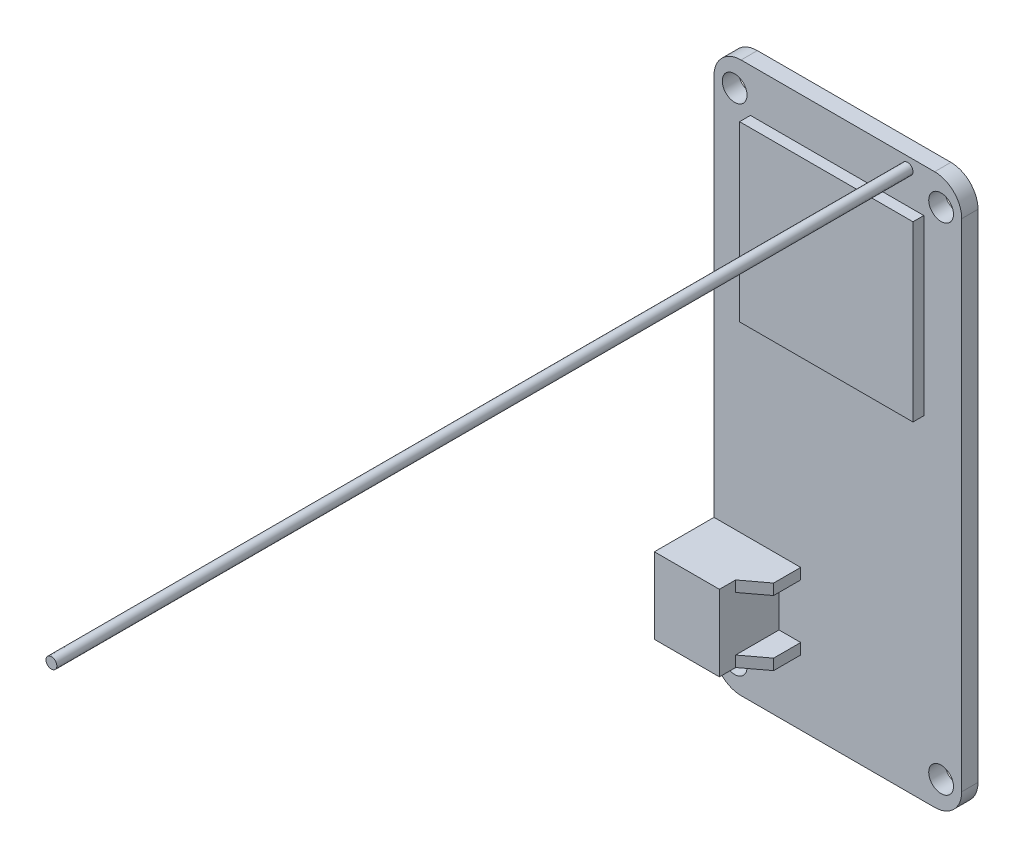
ISO-10303-21;
HEADER;
FILE_DESCRIPTION(('STEP AP214'),'2;1');
FILE_NAME('part.step','',(''),(''),'','','');
FILE_SCHEMA(('AUTOMOTIVE_DESIGN { 1 0 10303 214 1 1 1 1 }'));
ENDSEC;
DATA;
#1=APPLICATION_CONTEXT('core data for automotive mechanical design processes');
#2=APPLICATION_PROTOCOL_DEFINITION('international standard','automotive_design',2000,#1);
#3=PRODUCT_CONTEXT('',#1,'mechanical');
#4=PRODUCT('Part','Part','',(#3));
#5=PRODUCT_RELATED_PRODUCT_CATEGORY('part','',(#4));
#6=PRODUCT_DEFINITION_FORMATION('','',#4);
#7=PRODUCT_DEFINITION_CONTEXT('part definition',#1,'design');
#8=PRODUCT_DEFINITION('design','',#6,#7);
#9=PRODUCT_DEFINITION_SHAPE('','',#8);
#10=(LENGTH_UNIT() NAMED_UNIT(*) SI_UNIT(.MILLI.,.METRE.));
#11=(NAMED_UNIT(*) PLANE_ANGLE_UNIT() SI_UNIT($,.RADIAN.));
#12=(NAMED_UNIT(*) SI_UNIT($,.STERADIAN.) SOLID_ANGLE_UNIT());
#13=UNCERTAINTY_MEASURE_WITH_UNIT(LENGTH_MEASURE(1.E-05),#10,'distance_accuracy_value','');
#14=(GEOMETRIC_REPRESENTATION_CONTEXT(3) GLOBAL_UNCERTAINTY_ASSIGNED_CONTEXT((#13)) GLOBAL_UNIT_ASSIGNED_CONTEXT((#10,
#11,#12)) REPRESENTATION_CONTEXT('',''));
#15=CARTESIAN_POINT('',(0.,0.,0.));
#16=DIRECTION('',(0.,0.,1.));
#17=DIRECTION('',(1.,0.,0.));
#18=AXIS2_PLACEMENT_3D('',#15,#16,#17);
#19=CARTESIAN_POINT('',(-8.93,22.9,3.52777777777778));
#20=DIRECTION('',(0.,0.,1.));
#21=DIRECTION('',(1.,0.,0.));
#22=AXIS2_PLACEMENT_3D('',#19,#20,#21);
#23=PLANE('',#22);
#24=CARTESIAN_POINT('',(6.43,24.4,3.52777777777778));
#25=DIRECTION('',(0.,0.,1.));
#26=DIRECTION('',(1.,0.,0.));
#27=AXIS2_PLACEMENT_3D('',#24,#25,#26);
#28=CIRCLE('',#27,0.5);
#29=CARTESIAN_POINT('',(6.93,24.4,3.52777777777778));
#30=VERTEX_POINT('',#29);
#31=EDGE_CURVE('E249',#30,#30,#28,.T.);
#32=ORIENTED_EDGE('',*,*,#31,.F.);
#33=EDGE_LOOP('',(#32));
#34=FACE_BOUND('',#33,.T.);
#35=CARTESIAN_POINT('',(9.525,-22.86,3.52777777777778));
#36=DIRECTION('',(0.,0.,1.));
#37=DIRECTION('',(-1.,0.,0.));
#38=AXIS2_PLACEMENT_3D('',#35,#36,#37);
#39=CIRCLE('',#38,1.143);
#40=CARTESIAN_POINT('',(8.382,-22.86,3.52777777777778));
#41=VERTEX_POINT('',#40);
#42=EDGE_CURVE('E284',#41,#41,#39,.T.);
#43=ORIENTED_EDGE('',*,*,#42,.F.);
#44=EDGE_LOOP('',(#43));
#45=FACE_BOUND('',#44,.T.);
#46=CARTESIAN_POINT('',(-9.525,-22.86,3.52777777777778));
#47=DIRECTION('',(0.,0.,1.));
#48=DIRECTION('',(-1.,0.,0.));
#49=AXIS2_PLACEMENT_3D('',#46,#47,#48);
#50=CIRCLE('',#49,1.143);
#51=CARTESIAN_POINT('',(-10.668,-22.86,3.52777777777778));
#52=VERTEX_POINT('',#51);
#53=EDGE_CURVE('E288',#52,#52,#50,.T.);
#54=ORIENTED_EDGE('',*,*,#53,.F.);
#55=EDGE_LOOP('',(#54));
#56=FACE_BOUND('',#55,.T.);
#57=CARTESIAN_POINT('',(-9.525,22.86,3.52777777777778));
#58=DIRECTION('',(0.,0.,1.));
#59=DIRECTION('',(-1.,0.,0.));
#60=AXIS2_PLACEMENT_3D('',#57,#58,#59);
#61=CIRCLE('',#60,1.143);
#62=CARTESIAN_POINT('',(-10.668,22.86,3.52777777777778));
#63=VERTEX_POINT('',#62);
#64=EDGE_CURVE('E294',#63,#63,#61,.T.);
#65=ORIENTED_EDGE('',*,*,#64,.F.);
#66=EDGE_LOOP('',(#65));
#67=FACE_BOUND('',#66,.T.);
#68=CARTESIAN_POINT('',(9.525,22.86,3.52777777777778));
#69=DIRECTION('',(0.,0.,1.));
#70=DIRECTION('',(-1.,0.,0.));
#71=AXIS2_PLACEMENT_3D('',#68,#69,#70);
#72=CIRCLE('',#71,1.143);
#73=CARTESIAN_POINT('',(8.382,22.86,3.52777777777778));
#74=VERTEX_POINT('',#73);
#75=EDGE_CURVE('E300',#74,#74,#72,.T.);
#76=ORIENTED_EDGE('',*,*,#75,.F.);
#77=EDGE_LOOP('',(#76));
#78=FACE_BOUND('',#77,.T.);
#79=DIRECTION('',(-1.,0.,0.));
#80=VECTOR('',#79,1.);
#81=CARTESIAN_POINT('',(-8.07,21.4,3.52777777777778));
#82=LINE('',#81,#80);
#83=CARTESIAN_POINT('',(7.93,21.4,3.52777777777778));
#84=VERTEX_POINT('',#83);
#85=CARTESIAN_POINT('',(-8.07,21.4,3.52777777777778));
#86=VERTEX_POINT('',#85);
#87=EDGE_CURVE('E269',#84,#86,#82,.T.);
#88=ORIENTED_EDGE('',*,*,#87,.F.);
#89=DIRECTION('',(0.,1.,0.));
#90=VECTOR('',#89,1.);
#91=CARTESIAN_POINT('',(7.93,21.4,3.52777777777778));
#92=LINE('',#91,#90);
#93=CARTESIAN_POINT('',(7.93,5.4,3.52777777777778));
#94=VERTEX_POINT('',#93);
#95=EDGE_CURVE('E253',#94,#84,#92,.T.);
#96=ORIENTED_EDGE('',*,*,#95,.F.);
#97=DIRECTION('',(1.,0.,0.));
#98=VECTOR('',#97,1.);
#99=CARTESIAN_POINT('',(-8.07,5.4,3.52777777777778));
#100=LINE('',#99,#98);
#101=CARTESIAN_POINT('',(-8.07,5.4,3.52777777777778));
#102=VERTEX_POINT('',#101);
#103=EDGE_CURVE('E260',#102,#94,#100,.T.);
#104=ORIENTED_EDGE('',*,*,#103,.F.);
#105=DIRECTION('',(0.,-1.,0.));
#106=VECTOR('',#105,1.);
#107=CARTESIAN_POINT('',(-8.07,21.4,3.52777777777778));
#108=LINE('',#107,#106);
#109=EDGE_CURVE('E271',#86,#102,#108,.T.);
#110=ORIENTED_EDGE('',*,*,#109,.F.);
#111=EDGE_LOOP('',(#88,#96,#104,#110));
#112=FACE_BOUND('',#111,.T.);
#113=DIRECTION('',(0.,-1.,0.));
#114=VECTOR('',#113,1.);
#115=CARTESIAN_POINT('',(-11.43,22.9,3.52777777777778));
#116=LINE('',#115,#114);
#117=CARTESIAN_POINT('',(-11.43,22.9,3.52777777777778));
#118=VERTEX_POINT('',#117);
#119=CARTESIAN_POINT('',(-11.43,-12.4,3.52777777777778));
#120=VERTEX_POINT('',#119);
#121=EDGE_CURVE('E337',#118,#120,#116,.T.);
#122=ORIENTED_EDGE('',*,*,#121,.T.);
#123=DIRECTION('',(-1.,0.,0.));
#124=VECTOR('',#123,1.);
#125=CARTESIAN_POINT('',(-11.43,-12.4,3.52777777777778));
#126=LINE('',#125,#124);
#127=CARTESIAN_POINT('',(-3.43,-12.4,3.52777777777778));
#128=VERTEX_POINT('',#127);
#129=EDGE_CURVE('E232',#128,#120,#126,.T.);
#130=ORIENTED_EDGE('',*,*,#129,.F.);
#131=DIRECTION('',(0.,1.,0.));
#132=VECTOR('',#131,1.);
#133=CARTESIAN_POINT('',(-3.43,-12.4,3.52777777777778));
#134=LINE('',#133,#132);
#135=CARTESIAN_POINT('',(-3.43,-13.4,3.52777777777778));
#136=VERTEX_POINT('',#135);
#137=EDGE_CURVE('E229',#136,#128,#134,.T.);
#138=ORIENTED_EDGE('',*,*,#137,.F.);
#139=DIRECTION('',(1.,0.,0.));
#140=VECTOR('',#139,1.);
#141=CARTESIAN_POINT('',(-3.43,-13.4,3.52777777777778));
#142=LINE('',#141,#140);
#143=CARTESIAN_POINT('',(-5.43,-13.4,3.52777777777778));
#144=VERTEX_POINT('',#143);
#145=EDGE_CURVE('E226',#144,#136,#142,.T.);
#146=ORIENTED_EDGE('',*,*,#145,.F.);
#147=DIRECTION('',(0.,1.,0.));
#148=VECTOR('',#147,1.);
#149=CARTESIAN_POINT('',(-5.43,-13.4,3.52777777777778));
#150=LINE('',#149,#148);
#151=CARTESIAN_POINT('',(-5.43,-18.4,3.52777777777778));
#152=VERTEX_POINT('',#151);
#153=EDGE_CURVE('E223',#152,#144,#150,.T.);
#154=ORIENTED_EDGE('',*,*,#153,.F.);
#155=DIRECTION('',(-1.,0.,0.));
#156=VECTOR('',#155,1.);
#157=CARTESIAN_POINT('',(-5.43,-18.4,3.52777777777778));
#158=LINE('',#157,#156);
#159=CARTESIAN_POINT('',(-3.43,-18.4,3.52777777777778));
#160=VERTEX_POINT('',#159);
#161=EDGE_CURVE('E219',#160,#152,#158,.T.);
#162=ORIENTED_EDGE('',*,*,#161,.F.);
#163=DIRECTION('',(0.,1.,0.));
#164=VECTOR('',#163,1.);
#165=CARTESIAN_POINT('',(-3.43,-18.4,3.52777777777778));
#166=LINE('',#165,#164);
#167=CARTESIAN_POINT('',(-3.43,-19.4,3.52777777777778));
#168=VERTEX_POINT('',#167);
#169=EDGE_CURVE('E216',#168,#160,#166,.T.);
#170=ORIENTED_EDGE('',*,*,#169,.F.);
#171=DIRECTION('',(1.,0.,0.));
#172=VECTOR('',#171,1.);
#173=CARTESIAN_POINT('',(-11.43,-19.4,3.52777777777778));
#174=LINE('',#173,#172);
#175=CARTESIAN_POINT('',(-11.43,-19.4,3.52777777777778));
#176=VERTEX_POINT('',#175);
#177=EDGE_CURVE('E195',#176,#168,#174,.T.);
#178=ORIENTED_EDGE('',*,*,#177,.F.);
#179=CARTESIAN_POINT('',(-11.43,-22.9,3.52777777777778));
#180=VERTEX_POINT('',#179);
#181=EDGE_CURVE('E336',#176,#180,#116,.T.);
#182=ORIENTED_EDGE('',*,*,#181,.T.);
#183=CARTESIAN_POINT('',(-8.93,-22.9,3.52777777777778));
#184=DIRECTION('',(0.,0.,1.));
#185=DIRECTION('',(1.,0.,0.));
#186=AXIS2_PLACEMENT_3D('',#183,#184,#185);
#187=CIRCLE('',#186,2.5);
#188=CARTESIAN_POINT('',(-8.93,-25.4,3.52777777777778));
#189=VERTEX_POINT('',#188);
#190=EDGE_CURVE('E339',#180,#189,#187,.T.);
#191=ORIENTED_EDGE('',*,*,#190,.T.);
#192=DIRECTION('',(1.,0.,0.));
#193=VECTOR('',#192,1.);
#194=CARTESIAN_POINT('',(-8.93,-25.4,3.52777777777778));
#195=LINE('',#194,#193);
#196=CARTESIAN_POINT('',(8.93,-25.4,3.52777777777778));
#197=VERTEX_POINT('',#196);
#198=EDGE_CURVE('E342',#189,#197,#195,.T.);
#199=ORIENTED_EDGE('',*,*,#198,.T.);
#200=CARTESIAN_POINT('',(8.93,-22.9,3.52777777777778));
#201=DIRECTION('',(0.,0.,1.));
#202=DIRECTION('',(1.,0.,0.));
#203=AXIS2_PLACEMENT_3D('',#200,#201,#202);
#204=CIRCLE('',#203,2.5);
#205=CARTESIAN_POINT('',(11.43,-22.9,3.52777777777778));
#206=VERTEX_POINT('',#205);
#207=EDGE_CURVE('E345',#197,#206,#204,.T.);
#208=ORIENTED_EDGE('',*,*,#207,.T.);
#209=DIRECTION('',(0.,1.,0.));
#210=VECTOR('',#209,1.);
#211=CARTESIAN_POINT('',(11.43,-22.9,3.52777777777778));
#212=LINE('',#211,#210);
#213=CARTESIAN_POINT('',(11.43,22.9,3.52777777777778));
#214=VERTEX_POINT('',#213);
#215=EDGE_CURVE('E348',#206,#214,#212,.T.);
#216=ORIENTED_EDGE('',*,*,#215,.T.);
#217=CARTESIAN_POINT('',(8.93,22.9,3.52777777777778));
#218=DIRECTION('',(0.,0.,1.));
#219=DIRECTION('',(1.,0.,0.));
#220=AXIS2_PLACEMENT_3D('',#217,#218,#219);
#221=CIRCLE('',#220,2.5);
#222=CARTESIAN_POINT('',(8.93,25.4,3.52777777777778));
#223=VERTEX_POINT('',#222);
#224=EDGE_CURVE('E351',#214,#223,#221,.T.);
#225=ORIENTED_EDGE('',*,*,#224,.T.);
#226=DIRECTION('',(-1.,0.,0.));
#227=VECTOR('',#226,1.);
#228=CARTESIAN_POINT('',(8.93,25.4,3.52777777777778));
#229=LINE('',#228,#227);
#230=CARTESIAN_POINT('',(-8.93,25.4,3.52777777777778));
#231=VERTEX_POINT('',#230);
#232=EDGE_CURVE('E313',#223,#231,#229,.T.);
#233=ORIENTED_EDGE('',*,*,#232,.T.);
#234=CARTESIAN_POINT('',(-8.93,22.9,3.52777777777778));
#235=DIRECTION('',(0.,0.,1.));
#236=DIRECTION('',(1.,0.,0.));
#237=AXIS2_PLACEMENT_3D('',#234,#235,#236);
#238=CIRCLE('',#237,2.5);
#239=EDGE_CURVE('E306',#231,#118,#238,.T.);
#240=ORIENTED_EDGE('',*,*,#239,.T.);
#241=EDGE_LOOP('',(#122,#130,#138,#146,#154,#162,#170,#178,#182,#191,#199,#208,#216,#225,#233,#240));
#242=FACE_BOUND('',#241,.T.);
#243=ADVANCED_FACE('F33',(#34,#45,#56,#67,#78,#112,#242),#23,.T.);
#244=CARTESIAN_POINT('',(-8.93,22.9,2.02777777777778));
#245=DIRECTION('',(0.,0.,1.));
#246=DIRECTION('',(1.,0.,0.));
#247=AXIS2_PLACEMENT_3D('',#244,#245,#246);
#248=CYLINDRICAL_SURFACE('',#247,2.5);
#249=ORIENTED_EDGE('',*,*,#239,.F.);
#250=DIRECTION('',(0.,0.,1.));
#251=VECTOR('',#250,1.);
#252=CARTESIAN_POINT('',(-8.93,25.4,2.02777777777778));
#253=LINE('',#252,#251);
#254=CARTESIAN_POINT('',(-8.93,25.4,2.02777777777778));
#255=VERTEX_POINT('',#254);
#256=EDGE_CURVE('E11',#255,#231,#253,.T.);
#257=ORIENTED_EDGE('',*,*,#256,.F.);
#258=CARTESIAN_POINT('',(-8.93,22.9,2.02777777777778));
#259=DIRECTION('',(0.,0.,1.));
#260=DIRECTION('',(1.,0.,0.));
#261=AXIS2_PLACEMENT_3D('',#258,#259,#260);
#262=CIRCLE('',#261,2.5);
#263=CARTESIAN_POINT('',(-11.43,22.9,2.02777777777778));
#264=VERTEX_POINT('',#263);
#265=EDGE_CURVE('E309',#255,#264,#262,.T.);
#266=ORIENTED_EDGE('',*,*,#265,.T.);
#267=DIRECTION('',(0.,0.,1.));
#268=VECTOR('',#267,1.);
#269=CARTESIAN_POINT('',(-11.43,22.9,2.02777777777778));
#270=LINE('',#269,#268);
#271=EDGE_CURVE('E37',#264,#118,#270,.T.);
#272=ORIENTED_EDGE('',*,*,#271,.T.);
#273=EDGE_LOOP('',(#249,#257,#266,#272));
#274=FACE_BOUND('',#273,.T.);
#275=ADVANCED_FACE('F35',(#274),#248,.T.);
#276=CARTESIAN_POINT('',(8.93,25.4,2.02777777777778));
#277=DIRECTION('',(0.,1.,0.));
#278=DIRECTION('',(0.,0.,1.));
#279=AXIS2_PLACEMENT_3D('',#276,#277,#278);
#280=PLANE('',#279);
#281=ORIENTED_EDGE('',*,*,#232,.F.);
#282=DIRECTION('',(0.,0.,1.));
#283=VECTOR('',#282,1.);
#284=CARTESIAN_POINT('',(8.93,25.4,2.02777777777778));
#285=LINE('',#284,#283);
#286=CARTESIAN_POINT('',(8.93,25.4,2.02777777777778));
#287=VERTEX_POINT('',#286);
#288=EDGE_CURVE('E42',#287,#223,#285,.T.);
#289=ORIENTED_EDGE('',*,*,#288,.F.);
#290=DIRECTION('',(-1.,0.,0.));
#291=VECTOR('',#290,1.);
#292=CARTESIAN_POINT('',(8.93,25.4,2.02777777777778));
#293=LINE('',#292,#291);
#294=EDGE_CURVE('E331',#287,#255,#293,.T.);
#295=ORIENTED_EDGE('',*,*,#294,.T.);
#296=ORIENTED_EDGE('',*,*,#256,.T.);
#297=EDGE_LOOP('',(#281,#289,#295,#296));
#298=FACE_BOUND('',#297,.T.);
#299=ADVANCED_FACE('F379',(#298),#280,.T.);
#300=CARTESIAN_POINT('',(8.93,22.9,2.02777777777778));
#301=DIRECTION('',(0.,0.,1.));
#302=DIRECTION('',(1.,0.,0.));
#303=AXIS2_PLACEMENT_3D('',#300,#301,#302);
#304=CYLINDRICAL_SURFACE('',#303,2.5);
#305=ORIENTED_EDGE('',*,*,#224,.F.);
#306=DIRECTION('',(0.,0.,1.));
#307=VECTOR('',#306,1.);
#308=CARTESIAN_POINT('',(11.43,22.9,2.02777777777778));
#309=LINE('',#308,#307);
#310=CARTESIAN_POINT('',(11.43,22.9,2.02777777777778));
#311=VERTEX_POINT('',#310);
#312=EDGE_CURVE('E357',#311,#214,#309,.T.);
#313=ORIENTED_EDGE('',*,*,#312,.F.);
#314=CARTESIAN_POINT('',(8.93,22.9,2.02777777777778));
#315=DIRECTION('',(0.,0.,1.));
#316=DIRECTION('',(1.,0.,0.));
#317=AXIS2_PLACEMENT_3D('',#314,#315,#316);
#318=CIRCLE('',#317,2.5);
#319=EDGE_CURVE('E328',#311,#287,#318,.T.);
#320=ORIENTED_EDGE('',*,*,#319,.T.);
#321=ORIENTED_EDGE('',*,*,#288,.T.);
#322=EDGE_LOOP('',(#305,#313,#320,#321));
#323=FACE_BOUND('',#322,.T.);
#324=ADVANCED_FACE('F450',(#323),#304,.T.);
#325=CARTESIAN_POINT('',(11.43,-22.9,2.02777777777778));
#326=DIRECTION('',(1.,0.,0.));
#327=DIRECTION('',(0.,0.,-1.));
#328=AXIS2_PLACEMENT_3D('',#325,#326,#327);
#329=PLANE('',#328);
#330=ORIENTED_EDGE('',*,*,#215,.F.);
#331=DIRECTION('',(0.,0.,1.));
#332=VECTOR('',#331,1.);
#333=CARTESIAN_POINT('',(11.43,-22.9,2.02777777777778));
#334=LINE('',#333,#332);
#335=CARTESIAN_POINT('',(11.43,-22.9,2.02777777777778));
#336=VERTEX_POINT('',#335);
#337=EDGE_CURVE('E359',#336,#206,#334,.T.);
#338=ORIENTED_EDGE('',*,*,#337,.F.);
#339=DIRECTION('',(0.,1.,0.));
#340=VECTOR('',#339,1.);
#341=CARTESIAN_POINT('',(11.43,-22.9,2.02777777777778));
#342=LINE('',#341,#340);
#343=EDGE_CURVE('E325',#336,#311,#342,.T.);
#344=ORIENTED_EDGE('',*,*,#343,.T.);
#345=ORIENTED_EDGE('',*,*,#312,.T.);
#346=EDGE_LOOP('',(#330,#338,#344,#345));
#347=FACE_BOUND('',#346,.T.);
#348=ADVANCED_FACE('F453',(#347),#329,.T.);
#349=CARTESIAN_POINT('',(8.93,-22.9,2.02777777777778));
#350=DIRECTION('',(0.,0.,1.));
#351=DIRECTION('',(1.,0.,0.));
#352=AXIS2_PLACEMENT_3D('',#349,#350,#351);
#353=CYLINDRICAL_SURFACE('',#352,2.5);
#354=ORIENTED_EDGE('',*,*,#207,.F.);
#355=DIRECTION('',(0.,0.,1.));
#356=VECTOR('',#355,1.);
#357=CARTESIAN_POINT('',(8.93,-25.4,2.02777777777778));
#358=LINE('',#357,#356);
#359=CARTESIAN_POINT('',(8.93,-25.4,2.02777777777778));
#360=VERTEX_POINT('',#359);
#361=EDGE_CURVE('E361',#360,#197,#358,.T.);
#362=ORIENTED_EDGE('',*,*,#361,.F.);
#363=CARTESIAN_POINT('',(8.93,-22.9,2.02777777777778));
#364=DIRECTION('',(0.,0.,1.));
#365=DIRECTION('',(1.,0.,0.));
#366=AXIS2_PLACEMENT_3D('',#363,#364,#365);
#367=CIRCLE('',#366,2.5);
#368=EDGE_CURVE('E322',#360,#336,#367,.T.);
#369=ORIENTED_EDGE('',*,*,#368,.T.);
#370=ORIENTED_EDGE('',*,*,#337,.T.);
#371=EDGE_LOOP('',(#354,#362,#369,#370));
#372=FACE_BOUND('',#371,.T.);
#373=ADVANCED_FACE('F457',(#372),#353,.T.);
#374=CARTESIAN_POINT('',(-8.93,-25.4,2.02777777777778));
#375=DIRECTION('',(0.,-1.,0.));
#376=DIRECTION('',(0.,0.,-1.));
#377=AXIS2_PLACEMENT_3D('',#374,#375,#376);
#378=PLANE('',#377);
#379=ORIENTED_EDGE('',*,*,#198,.F.);
#380=DIRECTION('',(0.,0.,1.));
#381=VECTOR('',#380,1.);
#382=CARTESIAN_POINT('',(-8.93,-25.4,2.02777777777778));
#383=LINE('',#382,#381);
#384=CARTESIAN_POINT('',(-8.93,-25.4,2.02777777777778));
#385=VERTEX_POINT('',#384);
#386=EDGE_CURVE('E363',#385,#189,#383,.T.);
#387=ORIENTED_EDGE('',*,*,#386,.F.);
#388=DIRECTION('',(1.,0.,0.));
#389=VECTOR('',#388,1.);
#390=CARTESIAN_POINT('',(-8.93,-25.4,2.02777777777778));
#391=LINE('',#390,#389);
#392=EDGE_CURVE('E319',#385,#360,#391,.T.);
#393=ORIENTED_EDGE('',*,*,#392,.T.);
#394=ORIENTED_EDGE('',*,*,#361,.T.);
#395=EDGE_LOOP('',(#379,#387,#393,#394));
#396=FACE_BOUND('',#395,.T.);
#397=ADVANCED_FACE('F461',(#396),#378,.T.);
#398=CARTESIAN_POINT('',(-8.93,-22.9,2.02777777777778));
#399=DIRECTION('',(0.,0.,1.));
#400=DIRECTION('',(1.,0.,0.));
#401=AXIS2_PLACEMENT_3D('',#398,#399,#400);
#402=CYLINDRICAL_SURFACE('',#401,2.5);
#403=ORIENTED_EDGE('',*,*,#190,.F.);
#404=DIRECTION('',(0.,0.,1.));
#405=VECTOR('',#404,1.);
#406=CARTESIAN_POINT('',(-11.43,-22.9,2.02777777777778));
#407=LINE('',#406,#405);
#408=CARTESIAN_POINT('',(-11.43,-22.9,2.02777777777778));
#409=VERTEX_POINT('',#408);
#410=EDGE_CURVE('E364',#409,#180,#407,.T.);
#411=ORIENTED_EDGE('',*,*,#410,.F.);
#412=CARTESIAN_POINT('',(-8.93,-22.9,2.02777777777778));
#413=DIRECTION('',(0.,0.,1.));
#414=DIRECTION('',(1.,0.,0.));
#415=AXIS2_PLACEMENT_3D('',#412,#413,#414);
#416=CIRCLE('',#415,2.5);
#417=EDGE_CURVE('E316',#409,#385,#416,.T.);
#418=ORIENTED_EDGE('',*,*,#417,.T.);
#419=ORIENTED_EDGE('',*,*,#386,.T.);
#420=EDGE_LOOP('',(#403,#411,#418,#419));
#421=FACE_BOUND('',#420,.T.);
#422=ADVANCED_FACE('F388',(#421),#402,.T.);
#423=CARTESIAN_POINT('',(-11.43,22.9,2.02777777777778));
#424=DIRECTION('',(-1.,0.,0.));
#425=DIRECTION('',(0.,0.,1.));
#426=AXIS2_PLACEMENT_3D('',#423,#424,#425);
#427=PLANE('',#426);
#428=ORIENTED_EDGE('',*,*,#121,.F.);
#429=ORIENTED_EDGE('',*,*,#271,.F.);
#430=DIRECTION('',(0.,-1.,0.));
#431=VECTOR('',#430,1.);
#432=CARTESIAN_POINT('',(-11.43,22.9,2.02777777777778));
#433=LINE('',#432,#431);
#434=EDGE_CURVE('E312',#264,#409,#433,.T.);
#435=ORIENTED_EDGE('',*,*,#434,.T.);
#436=ORIENTED_EDGE('',*,*,#410,.T.);
#437=ORIENTED_EDGE('',*,*,#181,.F.);
#438=DIRECTION('',(0.,0.,-1.));
#439=VECTOR('',#438,1.);
#440=CARTESIAN_POINT('',(-11.43,-19.4,9.02777777777778));
#441=LINE('',#440,#439);
#442=CARTESIAN_POINT('',(-11.43,-19.4,9.02777777777778));
#443=VERTEX_POINT('',#442);
#444=EDGE_CURVE('E211',#443,#176,#441,.T.);
#445=ORIENTED_EDGE('',*,*,#444,.F.);
#446=DIRECTION('',(0.,-1.,0.));
#447=VECTOR('',#446,1.);
#448=CARTESIAN_POINT('',(-11.43,-12.4,9.02777777777778));
#449=LINE('',#448,#447);
#450=CARTESIAN_POINT('',(-11.43,-12.4,9.02777777777778));
#451=VERTEX_POINT('',#450);
#452=EDGE_CURVE('E207',#451,#443,#449,.T.);
#453=ORIENTED_EDGE('',*,*,#452,.F.);
#454=DIRECTION('',(0.,0.,-1.));
#455=VECTOR('',#454,1.);
#456=CARTESIAN_POINT('',(-11.43,-12.4,9.02777777777778));
#457=LINE('',#456,#455);
#458=EDGE_CURVE('E237',#451,#120,#457,.T.);
#459=ORIENTED_EDGE('',*,*,#458,.T.);
#460=EDGE_LOOP('',(#428,#429,#435,#436,#437,#445,#453,#459));
#461=FACE_BOUND('',#460,.T.);
#462=ADVANCED_FACE('F373',(#461),#427,.T.);
#463=CARTESIAN_POINT('',(-8.93,22.9,2.02777777777778));
#464=DIRECTION('',(0.,0.,1.));
#465=DIRECTION('',(1.,0.,0.));
#466=AXIS2_PLACEMENT_3D('',#463,#464,#465);
#467=PLANE('',#466);
#468=CARTESIAN_POINT('',(9.525,-22.86,2.02777777777778));
#469=DIRECTION('',(0.,0.,1.));
#470=DIRECTION('',(-1.,0.,0.));
#471=AXIS2_PLACEMENT_3D('',#468,#469,#470);
#472=CIRCLE('',#471,1.143);
#473=CARTESIAN_POINT('',(8.382,-22.86,2.02777777777778));
#474=VERTEX_POINT('',#473);
#475=EDGE_CURVE('E285',#474,#474,#472,.T.);
#476=ORIENTED_EDGE('',*,*,#475,.T.);
#477=EDGE_LOOP('',(#476));
#478=FACE_BOUND('',#477,.T.);
#479=CARTESIAN_POINT('',(-9.525,-22.86,2.02777777777778));
#480=DIRECTION('',(0.,0.,1.));
#481=DIRECTION('',(-1.,0.,0.));
#482=AXIS2_PLACEMENT_3D('',#479,#480,#481);
#483=CIRCLE('',#482,1.143);
#484=CARTESIAN_POINT('',(-10.668,-22.86,2.02777777777778));
#485=VERTEX_POINT('',#484);
#486=EDGE_CURVE('E291',#485,#485,#483,.T.);
#487=ORIENTED_EDGE('',*,*,#486,.T.);
#488=EDGE_LOOP('',(#487));
#489=FACE_BOUND('',#488,.T.);
#490=CARTESIAN_POINT('',(-9.525,22.86,2.02777777777778));
#491=DIRECTION('',(0.,0.,1.));
#492=DIRECTION('',(-1.,0.,0.));
#493=AXIS2_PLACEMENT_3D('',#490,#491,#492);
#494=CIRCLE('',#493,1.143);
#495=CARTESIAN_POINT('',(-10.668,22.86,2.02777777777778));
#496=VERTEX_POINT('',#495);
#497=EDGE_CURVE('E297',#496,#496,#494,.T.);
#498=ORIENTED_EDGE('',*,*,#497,.T.);
#499=EDGE_LOOP('',(#498));
#500=FACE_BOUND('',#499,.T.);
#501=CARTESIAN_POINT('',(9.525,22.86,2.02777777777778));
#502=DIRECTION('',(0.,0.,1.));
#503=DIRECTION('',(-1.,0.,0.));
#504=AXIS2_PLACEMENT_3D('',#501,#502,#503);
#505=CIRCLE('',#504,1.143);
#506=CARTESIAN_POINT('',(8.382,22.86,2.02777777777778));
#507=VERTEX_POINT('',#506);
#508=EDGE_CURVE('E303',#507,#507,#505,.T.);
#509=ORIENTED_EDGE('',*,*,#508,.T.);
#510=EDGE_LOOP('',(#509));
#511=FACE_BOUND('',#510,.T.);
#512=ORIENTED_EDGE('',*,*,#265,.F.);
#513=ORIENTED_EDGE('',*,*,#294,.F.);
#514=ORIENTED_EDGE('',*,*,#319,.F.);
#515=ORIENTED_EDGE('',*,*,#343,.F.);
#516=ORIENTED_EDGE('',*,*,#368,.F.);
#517=ORIENTED_EDGE('',*,*,#392,.F.);
#518=ORIENTED_EDGE('',*,*,#417,.F.);
#519=ORIENTED_EDGE('',*,*,#434,.F.);
#520=EDGE_LOOP('',(#512,#513,#514,#515,#516,#517,#518,#519));
#521=FACE_BOUND('',#520,.T.);
#522=ADVANCED_FACE('F382',(#478,#489,#500,#511,#521),#467,.F.);
#523=CARTESIAN_POINT('',(9.525,22.86,2.02777777777778));
#524=DIRECTION('',(0.,0.,1.));
#525=DIRECTION('',(1.,0.,0.));
#526=AXIS2_PLACEMENT_3D('',#523,#524,#525);
#527=CYLINDRICAL_SURFACE('',#526,1.143);
#528=ORIENTED_EDGE('',*,*,#508,.F.);
#529=EDGE_LOOP('',(#528));
#530=FACE_BOUND('',#529,.T.);
#531=ORIENTED_EDGE('',*,*,#75,.T.);
#532=EDGE_LOOP('',(#531));
#533=FACE_BOUND('',#532,.T.);
#534=ADVANCED_FACE('F471',(#530,#533),#527,.F.);
#535=CARTESIAN_POINT('',(-9.525,22.86,2.02777777777778));
#536=DIRECTION('',(0.,0.,1.));
#537=DIRECTION('',(1.,0.,0.));
#538=AXIS2_PLACEMENT_3D('',#535,#536,#537);
#539=CYLINDRICAL_SURFACE('',#538,1.143);
#540=ORIENTED_EDGE('',*,*,#497,.F.);
#541=EDGE_LOOP('',(#540));
#542=FACE_BOUND('',#541,.T.);
#543=ORIENTED_EDGE('',*,*,#64,.T.);
#544=EDGE_LOOP('',(#543));
#545=FACE_BOUND('',#544,.T.);
#546=ADVANCED_FACE('F476',(#542,#545),#539,.F.);
#547=CARTESIAN_POINT('',(-9.525,-22.86,2.02777777777778));
#548=DIRECTION('',(0.,0.,1.));
#549=DIRECTION('',(1.,0.,0.));
#550=AXIS2_PLACEMENT_3D('',#547,#548,#549);
#551=CYLINDRICAL_SURFACE('',#550,1.143);
#552=ORIENTED_EDGE('',*,*,#486,.F.);
#553=EDGE_LOOP('',(#552));
#554=FACE_BOUND('',#553,.T.);
#555=ORIENTED_EDGE('',*,*,#53,.T.);
#556=EDGE_LOOP('',(#555));
#557=FACE_BOUND('',#556,.T.);
#558=ADVANCED_FACE('F527',(#554,#557),#551,.F.);
#559=CARTESIAN_POINT('',(9.525,-22.86,2.02777777777778));
#560=DIRECTION('',(0.,0.,1.));
#561=DIRECTION('',(1.,0.,0.));
#562=AXIS2_PLACEMENT_3D('',#559,#560,#561);
#563=CYLINDRICAL_SURFACE('',#562,1.143);
#564=ORIENTED_EDGE('',*,*,#475,.F.);
#565=EDGE_LOOP('',(#564));
#566=FACE_BOUND('',#565,.T.);
#567=ORIENTED_EDGE('',*,*,#42,.T.);
#568=EDGE_LOOP('',(#567));
#569=FACE_BOUND('',#568,.T.);
#570=ADVANCED_FACE('F524',(#566,#569),#563,.F.);
#571=CARTESIAN_POINT('',(7.93,21.4,4.52777777777778));
#572=DIRECTION('',(-1.,0.,0.));
#573=DIRECTION('',(0.,-1.,0.));
#574=AXIS2_PLACEMENT_3D('',#571,#572,#573);
#575=PLANE('',#574);
#576=ORIENTED_EDGE('',*,*,#95,.T.);
#577=DIRECTION('',(0.,0.,-1.));
#578=VECTOR('',#577,1.);
#579=CARTESIAN_POINT('',(7.93,21.4,4.52777777777778));
#580=LINE('',#579,#578);
#581=CARTESIAN_POINT('',(7.93,21.4,4.52777777777778));
#582=VERTEX_POINT('',#581);
#583=EDGE_CURVE('E282',#582,#84,#580,.T.);
#584=ORIENTED_EDGE('',*,*,#583,.F.);
#585=DIRECTION('',(0.,1.,0.));
#586=VECTOR('',#585,1.);
#587=CARTESIAN_POINT('',(7.93,21.4,4.52777777777778));
#588=LINE('',#587,#586);
#589=CARTESIAN_POINT('',(7.93,5.4,4.52777777777778));
#590=VERTEX_POINT('',#589);
#591=EDGE_CURVE('E256',#590,#582,#588,.T.);
#592=ORIENTED_EDGE('',*,*,#591,.F.);
#593=DIRECTION('',(0.,0.,-1.));
#594=VECTOR('',#593,1.);
#595=CARTESIAN_POINT('',(7.93,5.4,4.52777777777778));
#596=LINE('',#595,#594);
#597=EDGE_CURVE('E266',#590,#94,#596,.T.);
#598=ORIENTED_EDGE('',*,*,#597,.T.);
#599=EDGE_LOOP('',(#576,#584,#592,#598));
#600=FACE_BOUND('',#599,.T.);
#601=ADVANCED_FACE('F507',(#600),#575,.F.);
#602=CARTESIAN_POINT('',(-8.07,21.4,4.52777777777778));
#603=DIRECTION('',(0.,-1.,0.));
#604=DIRECTION('',(0.,0.,-1.));
#605=AXIS2_PLACEMENT_3D('',#602,#603,#604);
#606=PLANE('',#605);
#607=ORIENTED_EDGE('',*,*,#87,.T.);
#608=DIRECTION('',(0.,0.,-1.));
#609=VECTOR('',#608,1.);
#610=CARTESIAN_POINT('',(-8.07,21.4,4.52777777777778));
#611=LINE('',#610,#609);
#612=CARTESIAN_POINT('',(-8.07,21.4,4.52777777777778));
#613=VERTEX_POINT('',#612);
#614=EDGE_CURVE('E279',#613,#86,#611,.T.);
#615=ORIENTED_EDGE('',*,*,#614,.F.);
#616=DIRECTION('',(-1.,0.,0.));
#617=VECTOR('',#616,1.);
#618=CARTESIAN_POINT('',(-8.07,21.4,4.52777777777778));
#619=LINE('',#618,#617);
#620=EDGE_CURVE('E259',#582,#613,#619,.T.);
#621=ORIENTED_EDGE('',*,*,#620,.F.);
#622=ORIENTED_EDGE('',*,*,#583,.T.);
#623=EDGE_LOOP('',(#607,#615,#621,#622));
#624=FACE_BOUND('',#623,.T.);
#625=ADVANCED_FACE('F495',(#624),#606,.F.);
#626=CARTESIAN_POINT('',(-8.07,21.4,4.52777777777778));
#627=DIRECTION('',(1.,0.,0.));
#628=DIRECTION('',(0.,1.,0.));
#629=AXIS2_PLACEMENT_3D('',#626,#627,#628);
#630=PLANE('',#629);
#631=ORIENTED_EDGE('',*,*,#109,.T.);
#632=DIRECTION('',(0.,0.,-1.));
#633=VECTOR('',#632,1.);
#634=CARTESIAN_POINT('',(-8.07,5.4,4.52777777777778));
#635=LINE('',#634,#633);
#636=CARTESIAN_POINT('',(-8.07,5.4,4.52777777777778));
#637=VERTEX_POINT('',#636);
#638=EDGE_CURVE('E277',#637,#102,#635,.T.);
#639=ORIENTED_EDGE('',*,*,#638,.F.);
#640=DIRECTION('',(0.,-1.,0.));
#641=VECTOR('',#640,1.);
#642=CARTESIAN_POINT('',(-8.07,21.4,4.52777777777778));
#643=LINE('',#642,#641);
#644=EDGE_CURVE('E262',#613,#637,#643,.T.);
#645=ORIENTED_EDGE('',*,*,#644,.F.);
#646=ORIENTED_EDGE('',*,*,#614,.T.);
#647=EDGE_LOOP('',(#631,#639,#645,#646));
#648=FACE_BOUND('',#647,.T.);
#649=ADVANCED_FACE('F499',(#648),#630,.F.);
#650=CARTESIAN_POINT('',(-8.07,5.4,4.52777777777778));
#651=DIRECTION('',(0.,1.,0.));
#652=DIRECTION('',(0.,0.,1.));
#653=AXIS2_PLACEMENT_3D('',#650,#651,#652);
#654=PLANE('',#653);
#655=ORIENTED_EDGE('',*,*,#103,.T.);
#656=ORIENTED_EDGE('',*,*,#597,.F.);
#657=DIRECTION('',(1.,0.,0.));
#658=VECTOR('',#657,1.);
#659=CARTESIAN_POINT('',(-8.07,5.4,4.52777777777778));
#660=LINE('',#659,#658);
#661=EDGE_CURVE('E264',#637,#590,#660,.T.);
#662=ORIENTED_EDGE('',*,*,#661,.F.);
#663=ORIENTED_EDGE('',*,*,#638,.T.);
#664=EDGE_LOOP('',(#655,#656,#662,#663));
#665=FACE_BOUND('',#664,.T.);
#666=ADVANCED_FACE('F509',(#665),#654,.F.);
#667=CARTESIAN_POINT('',(0.,0.,4.52777777777778));
#668=DIRECTION('',(0.,0.,1.));
#669=DIRECTION('',(1.,0.,0.));
#670=AXIS2_PLACEMENT_3D('',#667,#668,#669);
#671=PLANE('',#670);
#672=ORIENTED_EDGE('',*,*,#591,.T.);
#673=ORIENTED_EDGE('',*,*,#620,.T.);
#674=ORIENTED_EDGE('',*,*,#644,.T.);
#675=ORIENTED_EDGE('',*,*,#661,.T.);
#676=EDGE_LOOP('',(#672,#673,#674,#675));
#677=FACE_BOUND('',#676,.T.);
#678=ADVANCED_FACE('F503',(#677),#671,.T.);
#679=CARTESIAN_POINT('',(6.43,24.4,82.5277777777778));
#680=DIRECTION('',(0.,0.,-1.));
#681=DIRECTION('',(-1.,0.,0.));
#682=AXIS2_PLACEMENT_3D('',#679,#680,#681);
#683=CYLINDRICAL_SURFACE('',#682,0.5);
#684=CARTESIAN_POINT('',(6.43,24.4,82.5277777777778));
#685=DIRECTION('',(0.,0.,1.));
#686=DIRECTION('',(1.,0.,0.));
#687=AXIS2_PLACEMENT_3D('',#684,#685,#686);
#688=CIRCLE('',#687,0.5);
#689=CARTESIAN_POINT('',(6.93,24.4,82.5277777777778));
#690=VERTEX_POINT('',#689);
#691=EDGE_CURVE('E250',#690,#690,#688,.T.);
#692=ORIENTED_EDGE('',*,*,#691,.F.);
#693=EDGE_LOOP('',(#692));
#694=FACE_BOUND('',#693,.T.);
#695=ORIENTED_EDGE('',*,*,#31,.T.);
#696=EDGE_LOOP('',(#695));
#697=FACE_BOUND('',#696,.T.);
#698=ADVANCED_FACE('F516',(#694,#697),#683,.T.);
#699=CARTESIAN_POINT('',(6.43,24.4,82.5277777777778));
#700=DIRECTION('',(0.,0.,1.));
#701=DIRECTION('',(1.,0.,0.));
#702=AXIS2_PLACEMENT_3D('',#699,#700,#701);
#703=PLANE('',#702);
#704=ORIENTED_EDGE('',*,*,#691,.T.);
#705=EDGE_LOOP('',(#704));
#706=FACE_BOUND('',#705,.T.);
#707=ADVANCED_FACE('F558',(#706),#703,.T.);
#708=CARTESIAN_POINT('',(-3.43,-18.4,9.02777777777778));
#709=DIRECTION('',(-1.,0.,0.));
#710=DIRECTION('',(0.,-1.,0.));
#711=AXIS2_PLACEMENT_3D('',#708,#709,#710);
#712=PLANE('',#711);
#713=DIRECTION('',(0.,0.,-1.));
#714=VECTOR('',#713,1.);
#715=CARTESIAN_POINT('',(-3.43,-18.4,9.02777777777778));
#716=LINE('',#715,#714);
#717=CARTESIAN_POINT('',(-3.43,-18.4,6.02777777777778));
#718=VERTEX_POINT('',#717);
#719=EDGE_CURVE('E247',#718,#160,#716,.T.);
#720=ORIENTED_EDGE('',*,*,#719,.F.);
#721=DIRECTION('',(0.,-1.,0.));
#722=VECTOR('',#721,1.);
#723=CARTESIAN_POINT('',(-3.43,25.4,6.02777777777778));
#724=LINE('',#723,#722);
#725=CARTESIAN_POINT('',(-3.43,-19.4,6.02777777777778));
#726=VERTEX_POINT('',#725);
#727=EDGE_CURVE('E396',#718,#726,#724,.T.);
#728=ORIENTED_EDGE('',*,*,#727,.T.);
#729=DIRECTION('',(0.,0.,-1.));
#730=VECTOR('',#729,1.);
#731=CARTESIAN_POINT('',(-3.43,-19.4,9.02777777777778));
#732=LINE('',#731,#730);
#733=EDGE_CURVE('E209',#726,#168,#732,.T.);
#734=ORIENTED_EDGE('',*,*,#733,.T.);
#735=ORIENTED_EDGE('',*,*,#169,.T.);
#736=EDGE_LOOP('',(#720,#728,#734,#735));
#737=FACE_BOUND('',#736,.T.);
#738=ADVANCED_FACE('F395',(#737),#712,.F.);
#739=CARTESIAN_POINT('',(-5.43,-18.4,9.02777777777778));
#740=DIRECTION('',(0.,-1.,0.));
#741=DIRECTION('',(0.,0.,-1.));
#742=AXIS2_PLACEMENT_3D('',#739,#740,#741);
#743=PLANE('',#742);
#744=DIRECTION('',(0.,0.,-1.));
#745=VECTOR('',#744,1.);
#746=CARTESIAN_POINT('',(-5.43,-18.4,9.02777777777778));
#747=LINE('',#746,#745);
#748=CARTESIAN_POINT('',(-5.43,-18.4,7.52777777777778));
#749=VERTEX_POINT('',#748);
#750=EDGE_CURVE('E245',#749,#152,#747,.T.);
#751=ORIENTED_EDGE('',*,*,#750,.F.);
#752=DIRECTION('',(0.8,0.,-0.6));
#753=VECTOR('',#752,1.);
#754=CARTESIAN_POINT('',(-6.15,-18.4,8.06777777777778));
#755=LINE('',#754,#753);
#756=EDGE_CURVE('E220',#749,#718,#755,.T.);
#757=ORIENTED_EDGE('',*,*,#756,.T.);
#758=ORIENTED_EDGE('',*,*,#719,.T.);
#759=ORIENTED_EDGE('',*,*,#161,.T.);
#760=EDGE_LOOP('',(#751,#757,#758,#759));
#761=FACE_BOUND('',#760,.T.);
#762=ADVANCED_FACE('F402',(#761),#743,.F.);
#763=CARTESIAN_POINT('',(-5.43,-13.4,9.02777777777778));
#764=DIRECTION('',(-1.,0.,0.));
#765=DIRECTION('',(0.,-1.,0.));
#766=AXIS2_PLACEMENT_3D('',#763,#764,#765);
#767=PLANE('',#766);
#768=DIRECTION('',(0.,0.,-1.));
#769=VECTOR('',#768,1.);
#770=CARTESIAN_POINT('',(-5.43,-13.4,9.02777777777778));
#771=LINE('',#770,#769);
#772=CARTESIAN_POINT('',(-5.43,-13.4,7.52777777777778));
#773=VERTEX_POINT('',#772);
#774=EDGE_CURVE('E243',#773,#144,#771,.T.);
#775=ORIENTED_EDGE('',*,*,#774,.F.);
#776=DIRECTION('',(0.,-1.,0.));
#777=VECTOR('',#776,1.);
#778=CARTESIAN_POINT('',(-5.43,25.4,7.52777777777778));
#779=LINE('',#778,#777);
#780=CARTESIAN_POINT('',(-5.43,-12.4,7.52777777777778));
#781=VERTEX_POINT('',#780);
#782=EDGE_CURVE('E421',#781,#773,#779,.T.);
#783=ORIENTED_EDGE('',*,*,#782,.F.);
#784=DIRECTION('',(0.,0.,-1.));
#785=VECTOR('',#784,1.);
#786=CARTESIAN_POINT('',(-5.43,-12.4,9.02777777777778));
#787=LINE('',#786,#785);
#788=CARTESIAN_POINT('',(-5.43,-12.4,9.02777777777778));
#789=VERTEX_POINT('',#788);
#790=EDGE_CURVE('E192',#789,#781,#787,.T.);
#791=ORIENTED_EDGE('',*,*,#790,.F.);
#792=DIRECTION('',(0.,1.,0.));
#793=VECTOR('',#792,1.);
#794=CARTESIAN_POINT('',(-5.43,-13.4,9.02777777777778));
#795=LINE('',#794,#793);
#796=CARTESIAN_POINT('',(-5.43,-19.4,9.02777777777778));
#797=VERTEX_POINT('',#796);
#798=EDGE_CURVE('E50',#797,#789,#795,.T.);
#799=ORIENTED_EDGE('',*,*,#798,.F.);
#800=DIRECTION('',(0.,0.,-1.));
#801=VECTOR('',#800,1.);
#802=CARTESIAN_POINT('',(-5.43,-19.4,9.02777777777778));
#803=LINE('',#802,#801);
#804=CARTESIAN_POINT('',(-5.43,-19.4,7.52777777777778));
#805=VERTEX_POINT('',#804);
#806=EDGE_CURVE('E188',#797,#805,#803,.T.);
#807=ORIENTED_EDGE('',*,*,#806,.T.);
#808=EDGE_CURVE('E420',#749,#805,#779,.T.);
#809=ORIENTED_EDGE('',*,*,#808,.F.);
#810=ORIENTED_EDGE('',*,*,#750,.T.);
#811=ORIENTED_EDGE('',*,*,#153,.T.);
#812=EDGE_LOOP('',(#775,#783,#791,#799,#807,#809,#810,#811));
#813=FACE_BOUND('',#812,.T.);
#814=ADVANCED_FACE('F186',(#813),#767,.F.);
#815=CARTESIAN_POINT('',(-3.43,-13.4,9.02777777777778));
#816=DIRECTION('',(0.,1.,0.));
#817=DIRECTION('',(0.,0.,1.));
#818=AXIS2_PLACEMENT_3D('',#815,#816,#817);
#819=PLANE('',#818);
#820=DIRECTION('',(0.,0.,-1.));
#821=VECTOR('',#820,1.);
#822=CARTESIAN_POINT('',(-3.43,-13.4,9.02777777777778));
#823=LINE('',#822,#821);
#824=CARTESIAN_POINT('',(-3.43,-13.4,6.02777777777778));
#825=VERTEX_POINT('',#824);
#826=EDGE_CURVE('E241',#825,#136,#823,.T.);
#827=ORIENTED_EDGE('',*,*,#826,.F.);
#828=DIRECTION('',(-0.8,0.,0.6));
#829=VECTOR('',#828,1.);
#830=CARTESIAN_POINT('',(-4.87,-13.4,7.10777777777778));
#831=LINE('',#830,#829);
#832=EDGE_CURVE('E405',#825,#773,#831,.T.);
#833=ORIENTED_EDGE('',*,*,#832,.T.);
#834=ORIENTED_EDGE('',*,*,#774,.T.);
#835=ORIENTED_EDGE('',*,*,#145,.T.);
#836=EDGE_LOOP('',(#827,#833,#834,#835));
#837=FACE_BOUND('',#836,.T.);
#838=ADVANCED_FACE('F419',(#837),#819,.F.);
#839=CARTESIAN_POINT('',(-3.43,-12.4,9.02777777777778));
#840=DIRECTION('',(-1.,0.,0.));
#841=DIRECTION('',(0.,0.,1.));
#842=AXIS2_PLACEMENT_3D('',#839,#840,#841);
#843=PLANE('',#842);
#844=DIRECTION('',(0.,0.,-1.));
#845=VECTOR('',#844,1.);
#846=CARTESIAN_POINT('',(-3.43,-12.4,9.02777777777778));
#847=LINE('',#846,#845);
#848=CARTESIAN_POINT('',(-3.43,-12.4,6.02777777777778));
#849=VERTEX_POINT('',#848);
#850=EDGE_CURVE('E58',#849,#128,#847,.T.);
#851=ORIENTED_EDGE('',*,*,#850,.F.);
#852=EDGE_CURVE('E417',#849,#825,#724,.T.);
#853=ORIENTED_EDGE('',*,*,#852,.T.);
#854=ORIENTED_EDGE('',*,*,#826,.T.);
#855=ORIENTED_EDGE('',*,*,#137,.T.);
#856=EDGE_LOOP('',(#851,#853,#854,#855));
#857=FACE_BOUND('',#856,.T.);
#858=ADVANCED_FACE('F414',(#857),#843,.F.);
#859=CARTESIAN_POINT('',(-11.43,-12.4,9.02777777777778));
#860=DIRECTION('',(0.,-1.,0.));
#861=DIRECTION('',(1.,0.,0.));
#862=AXIS2_PLACEMENT_3D('',#859,#860,#861);
#863=PLANE('',#862);
#864=ORIENTED_EDGE('',*,*,#790,.T.);
#865=DIRECTION('',(0.8,0.,-0.6));
#866=VECTOR('',#865,1.);
#867=CARTESIAN_POINT('',(-9.98999999999999,-12.4,10.9477777777778));
#868=LINE('',#867,#866);
#869=EDGE_CURVE('E408',#781,#849,#868,.T.);
#870=ORIENTED_EDGE('',*,*,#869,.T.);
#871=ORIENTED_EDGE('',*,*,#850,.T.);
#872=ORIENTED_EDGE('',*,*,#129,.T.);
#873=ORIENTED_EDGE('',*,*,#458,.F.);
#874=DIRECTION('',(-1.,0.,0.));
#875=VECTOR('',#874,1.);
#876=CARTESIAN_POINT('',(-11.43,-12.4,9.02777777777778));
#877=LINE('',#876,#875);
#878=EDGE_CURVE('E194',#789,#451,#877,.T.);
#879=ORIENTED_EDGE('',*,*,#878,.F.);
#880=EDGE_LOOP('',(#864,#870,#871,#872,#873,#879));
#881=FACE_BOUND('',#880,.T.);
#882=ADVANCED_FACE('F411',(#881),#863,.F.);
#883=CARTESIAN_POINT('',(-11.43,-19.4,9.02777777777778));
#884=DIRECTION('',(0.,1.,0.));
#885=DIRECTION('',(0.,0.,1.));
#886=AXIS2_PLACEMENT_3D('',#883,#884,#885);
#887=PLANE('',#886);
#888=ORIENTED_EDGE('',*,*,#733,.F.);
#889=DIRECTION('',(0.8,0.,-0.6));
#890=VECTOR('',#889,1.);
#891=CARTESIAN_POINT('',(-5.43,-19.4,7.52777777777778));
#892=LINE('',#891,#890);
#893=EDGE_CURVE('E203',#805,#726,#892,.T.);
#894=ORIENTED_EDGE('',*,*,#893,.F.);
#895=ORIENTED_EDGE('',*,*,#806,.F.);
#896=DIRECTION('',(1.,0.,0.));
#897=VECTOR('',#896,1.);
#898=CARTESIAN_POINT('',(-11.43,-19.4,9.02777777777778));
#899=LINE('',#898,#897);
#900=EDGE_CURVE('E202',#443,#797,#899,.T.);
#901=ORIENTED_EDGE('',*,*,#900,.F.);
#902=ORIENTED_EDGE('',*,*,#444,.T.);
#903=ORIENTED_EDGE('',*,*,#177,.T.);
#904=EDGE_LOOP('',(#888,#894,#895,#901,#902,#903));
#905=FACE_BOUND('',#904,.T.);
#906=ADVANCED_FACE('F200',(#905),#887,.F.);
#907=CARTESIAN_POINT('',(0.,0.,9.02777777777778));
#908=DIRECTION('',(0.,0.,1.));
#909=DIRECTION('',(1.,0.,0.));
#910=AXIS2_PLACEMENT_3D('',#907,#908,#909);
#911=PLANE('',#910);
#912=ORIENTED_EDGE('',*,*,#798,.T.);
#913=ORIENTED_EDGE('',*,*,#878,.T.);
#914=ORIENTED_EDGE('',*,*,#452,.T.);
#915=ORIENTED_EDGE('',*,*,#900,.T.);
#916=EDGE_LOOP('',(#912,#913,#914,#915));
#917=FACE_BOUND('',#916,.T.);
#918=ADVANCED_FACE('F205',(#917),#911,.T.);
#919=CARTESIAN_POINT('',(-5.43,25.4,7.52777777777778));
#920=DIRECTION('',(-0.6,0.,-0.8));
#921=DIRECTION('',(-0.8,0.,0.6));
#922=AXIS2_PLACEMENT_3D('',#919,#920,#921);
#923=PLANE('',#922);
#924=ORIENTED_EDGE('',*,*,#808,.T.);
#925=ORIENTED_EDGE('',*,*,#893,.T.);
#926=ORIENTED_EDGE('',*,*,#727,.F.);
#927=ORIENTED_EDGE('',*,*,#756,.F.);
#928=EDGE_LOOP('',(#924,#925,#926,#927));
#929=FACE_BOUND('',#928,.T.);
#930=ADVANCED_FACE('F429',(#929),#923,.F.);
#931=ORIENTED_EDGE('',*,*,#852,.F.);
#932=ORIENTED_EDGE('',*,*,#869,.F.);
#933=ORIENTED_EDGE('',*,*,#782,.T.);
#934=ORIENTED_EDGE('',*,*,#832,.F.);
#935=EDGE_LOOP('',(#931,#932,#933,#934));
#936=FACE_BOUND('',#935,.T.);
#937=ADVANCED_FACE('F427',(#936),#923,.F.);
#938=CLOSED_SHELL('',(#243,#275,#299,#324,#348,#373,#397,#422,#462,#522,#534,#546,#558,#570,
#601,#625,#649,#666,#678,#698,#707,#738,#762,#814,#838,#858,#882,#906,#918,#930,#937));
#939=MANIFOLD_SOLID_BREP('B2',#938);
#940=ADVANCED_BREP_SHAPE_REPRESENTATION('',(#18,#939),#14);
#941=SHAPE_DEFINITION_REPRESENTATION(#9,#940);
ENDSEC;
END-ISO-10303-21;
